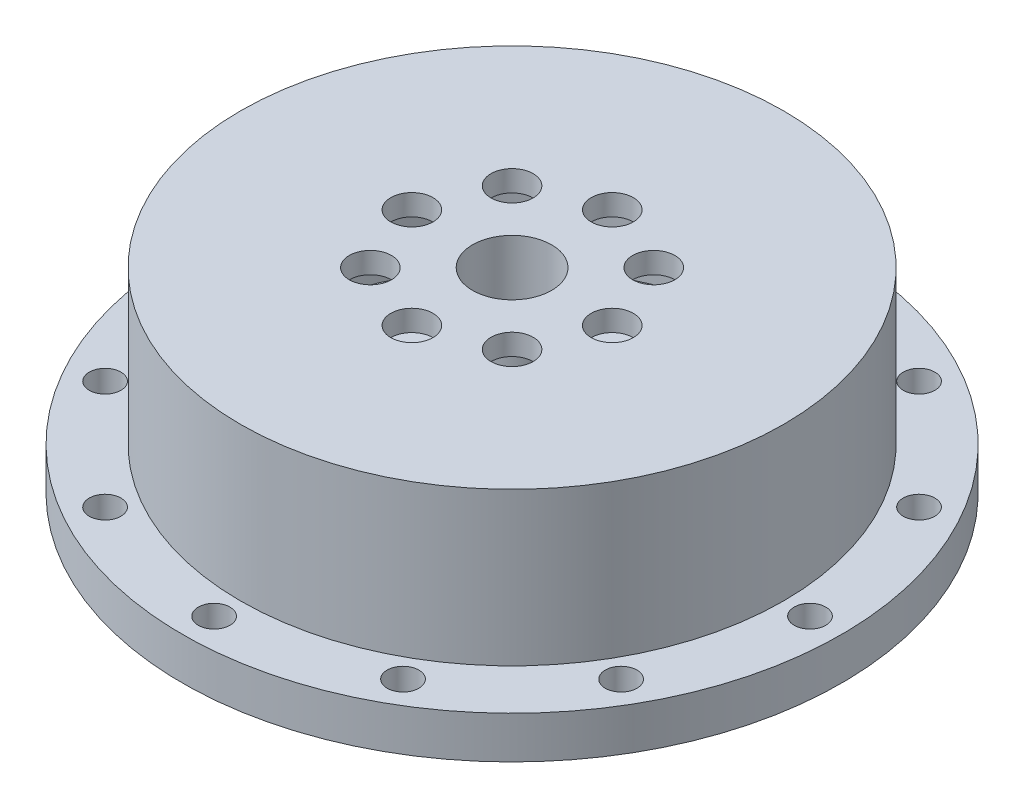
ISO-10303-21;
HEADER;
FILE_DESCRIPTION(('STEP AP214'),'2;1');
FILE_NAME('part.step','',(''),(''),'','','');
FILE_SCHEMA(('AUTOMOTIVE_DESIGN { 1 0 10303 214 1 1 1 1 }'));
ENDSEC;
DATA;
#1=APPLICATION_CONTEXT('core data for automotive mechanical design processes');
#2=APPLICATION_PROTOCOL_DEFINITION('international standard','automotive_design',2000,#1);
#3=PRODUCT_CONTEXT('',#1,'mechanical');
#4=PRODUCT('Part','Part','',(#3));
#5=PRODUCT_RELATED_PRODUCT_CATEGORY('part','',(#4));
#6=PRODUCT_DEFINITION_FORMATION('','',#4);
#7=PRODUCT_DEFINITION_CONTEXT('part definition',#1,'design');
#8=PRODUCT_DEFINITION('design','',#6,#7);
#9=PRODUCT_DEFINITION_SHAPE('','',#8);
#10=(LENGTH_UNIT() NAMED_UNIT(*) SI_UNIT(.MILLI.,.METRE.));
#11=(NAMED_UNIT(*) PLANE_ANGLE_UNIT() SI_UNIT($,.RADIAN.));
#12=(NAMED_UNIT(*) SI_UNIT($,.STERADIAN.) SOLID_ANGLE_UNIT());
#13=UNCERTAINTY_MEASURE_WITH_UNIT(LENGTH_MEASURE(1.E-05),#10,'distance_accuracy_value','');
#14=(GEOMETRIC_REPRESENTATION_CONTEXT(3) GLOBAL_UNCERTAINTY_ASSIGNED_CONTEXT((#13)) GLOBAL_UNIT_ASSIGNED_CONTEXT((#10,
#11,#12)) REPRESENTATION_CONTEXT('',''));
#15=CARTESIAN_POINT('',(0.,0.,0.));
#16=DIRECTION('',(0.,0.,1.));
#17=DIRECTION('',(1.,0.,0.));
#18=AXIS2_PLACEMENT_3D('',#15,#16,#17);
#19=CARTESIAN_POINT('',(7.5,32.2161096228833,0.));
#20=DIRECTION('',(0.,-1.,0.));
#21=DIRECTION('',(0.,0.,-1.));
#22=AXIS2_PLACEMENT_3D('',#19,#20,#21);
#23=PLANE('',#22);
#24=CARTESIAN_POINT('',(0.,32.2161096228833,0.));
#25=DIRECTION('',(0.,-1.,0.));
#26=DIRECTION('',(0.,0.,-1.));
#27=AXIS2_PLACEMENT_3D('',#24,#25,#26);
#28=CIRCLE('',#27,10.5);
#29=CARTESIAN_POINT('',(0.,32.2161096228833,-10.5));
#30=VERTEX_POINT('',#29);
#31=EDGE_CURVE('E11',#30,#30,#28,.T.);
#32=ORIENTED_EDGE('',*,*,#31,.T.);
#33=EDGE_LOOP('',(#32));
#34=FACE_BOUND('',#33,.T.);
#35=CARTESIAN_POINT('',(0.,32.2161096228833,0.));
#36=DIRECTION('',(0.,-1.,0.));
#37=DIRECTION('',(0.,0.,-1.));
#38=AXIS2_PLACEMENT_3D('',#35,#36,#37);
#39=CIRCLE('',#38,7.5);
#40=CARTESIAN_POINT('',(0.,32.2161096228833,-7.5));
#41=VERTEX_POINT('',#40);
#42=EDGE_CURVE('E233',#41,#41,#39,.T.);
#43=ORIENTED_EDGE('',*,*,#42,.F.);
#44=EDGE_LOOP('',(#43));
#45=FACE_BOUND('',#44,.T.);
#46=ADVANCED_FACE('F39',(#34,#45),#23,.T.);
#47=CARTESIAN_POINT('',(0.,0.,0.));
#48=DIRECTION('',(0.,-1.,0.));
#49=DIRECTION('',(0.,0.,-1.));
#50=AXIS2_PLACEMENT_3D('',#47,#48,#49);
#51=CYLINDRICAL_SURFACE('',#50,10.5);
#52=CARTESIAN_POINT('',(0.,39.2161096228833,0.));
#53=DIRECTION('',(0.,-1.,0.));
#54=DIRECTION('',(0.,0.,-1.));
#55=AXIS2_PLACEMENT_3D('',#52,#53,#54);
#56=CIRCLE('',#55,10.5);
#57=CARTESIAN_POINT('',(0.,39.2161096228833,-10.5));
#58=VERTEX_POINT('',#57);
#59=EDGE_CURVE('E46',#58,#58,#56,.T.);
#60=ORIENTED_EDGE('',*,*,#59,.T.);
#61=EDGE_LOOP('',(#60));
#62=FACE_BOUND('',#61,.T.);
#63=ORIENTED_EDGE('',*,*,#31,.F.);
#64=EDGE_LOOP('',(#63));
#65=FACE_BOUND('',#64,.T.);
#66=ADVANCED_FACE('F280',(#62,#65),#51,.T.);
#67=CARTESIAN_POINT('',(10.5,39.2161096228833,0.));
#68=DIRECTION('',(0.,-1.,0.));
#69=DIRECTION('',(0.,0.,-1.));
#70=AXIS2_PLACEMENT_3D('',#67,#68,#69);
#71=PLANE('',#70);
#72=CARTESIAN_POINT('',(13.4350288425444,39.2161096228833,-13.4350288425444));
#73=DIRECTION('',(0.,-1.,0.));
#74=DIRECTION('',(0.,0.,-1.));
#75=AXIS2_PLACEMENT_3D('',#72,#73,#74);
#76=CIRCLE('',#75,4.);
#77=CARTESIAN_POINT('',(13.4350288425444,39.2161096228833,-17.4350288425444));
#78=VERTEX_POINT('',#77);
#79=EDGE_CURVE('E158',#78,#78,#76,.T.);
#80=ORIENTED_EDGE('',*,*,#79,.F.);
#81=EDGE_LOOP('',(#80));
#82=FACE_BOUND('',#81,.T.);
#83=CARTESIAN_POINT('',(0.,39.2161096228833,-19.));
#84=DIRECTION('',(0.,-1.,0.));
#85=DIRECTION('',(0.,0.,-1.));
#86=AXIS2_PLACEMENT_3D('',#83,#84,#85);
#87=CIRCLE('',#86,4.);
#88=CARTESIAN_POINT('',(0.,39.2161096228833,-23.));
#89=VERTEX_POINT('',#88);
#90=EDGE_CURVE('E155',#89,#89,#87,.T.);
#91=ORIENTED_EDGE('',*,*,#90,.F.);
#92=EDGE_LOOP('',(#91));
#93=FACE_BOUND('',#92,.T.);
#94=CARTESIAN_POINT('',(-13.4350288425444,39.2161096228833,-13.4350288425444));
#95=DIRECTION('',(0.,-1.,0.));
#96=DIRECTION('',(0.,0.,-1.));
#97=AXIS2_PLACEMENT_3D('',#94,#95,#96);
#98=CIRCLE('',#97,4.);
#99=CARTESIAN_POINT('',(-13.4350288425444,39.2161096228833,-17.4350288425444));
#100=VERTEX_POINT('',#99);
#101=EDGE_CURVE('E152',#100,#100,#98,.T.);
#102=ORIENTED_EDGE('',*,*,#101,.F.);
#103=EDGE_LOOP('',(#102));
#104=FACE_BOUND('',#103,.T.);
#105=CARTESIAN_POINT('',(-19.,39.2161096228833,0.));
#106=DIRECTION('',(0.,-1.,0.));
#107=DIRECTION('',(0.,0.,-1.));
#108=AXIS2_PLACEMENT_3D('',#105,#106,#107);
#109=CIRCLE('',#108,4.);
#110=CARTESIAN_POINT('',(-19.,39.2161096228833,-4.));
#111=VERTEX_POINT('',#110);
#112=EDGE_CURVE('E149',#111,#111,#109,.T.);
#113=ORIENTED_EDGE('',*,*,#112,.F.);
#114=EDGE_LOOP('',(#113));
#115=FACE_BOUND('',#114,.T.);
#116=CARTESIAN_POINT('',(-13.4350288425444,39.2161096228833,13.4350288425444));
#117=DIRECTION('',(0.,-1.,0.));
#118=DIRECTION('',(0.,0.,-1.));
#119=AXIS2_PLACEMENT_3D('',#116,#117,#118);
#120=CIRCLE('',#119,4.);
#121=CARTESIAN_POINT('',(-13.4350288425444,39.2161096228833,9.4350288425444));
#122=VERTEX_POINT('',#121);
#123=EDGE_CURVE('E146',#122,#122,#120,.T.);
#124=ORIENTED_EDGE('',*,*,#123,.F.);
#125=EDGE_LOOP('',(#124));
#126=FACE_BOUND('',#125,.T.);
#127=CARTESIAN_POINT('',(0.,39.2161096228833,19.));
#128=DIRECTION('',(0.,-1.,0.));
#129=DIRECTION('',(0.,0.,-1.));
#130=AXIS2_PLACEMENT_3D('',#127,#128,#129);
#131=CIRCLE('',#130,4.);
#132=CARTESIAN_POINT('',(0.,39.2161096228833,15.));
#133=VERTEX_POINT('',#132);
#134=EDGE_CURVE('E143',#133,#133,#131,.T.);
#135=ORIENTED_EDGE('',*,*,#134,.F.);
#136=EDGE_LOOP('',(#135));
#137=FACE_BOUND('',#136,.T.);
#138=CARTESIAN_POINT('',(13.4350288425444,39.2161096228833,13.4350288425444));
#139=DIRECTION('',(0.,-1.,0.));
#140=DIRECTION('',(0.,0.,-1.));
#141=AXIS2_PLACEMENT_3D('',#138,#139,#140);
#142=CIRCLE('',#141,4.);
#143=CARTESIAN_POINT('',(13.4350288425444,39.2161096228833,9.43502884254441));
#144=VERTEX_POINT('',#143);
#145=EDGE_CURVE('E140',#144,#144,#142,.T.);
#146=ORIENTED_EDGE('',*,*,#145,.F.);
#147=EDGE_LOOP('',(#146));
#148=FACE_BOUND('',#147,.T.);
#149=CARTESIAN_POINT('',(19.,39.2161096228833,0.));
#150=DIRECTION('',(0.,-1.,0.));
#151=DIRECTION('',(0.,0.,-1.));
#152=AXIS2_PLACEMENT_3D('',#149,#150,#151);
#153=CIRCLE('',#152,4.);
#154=CARTESIAN_POINT('',(19.,39.2161096228833,-4.));
#155=VERTEX_POINT('',#154);
#156=EDGE_CURVE('E137',#155,#155,#153,.T.);
#157=ORIENTED_EDGE('',*,*,#156,.F.);
#158=EDGE_LOOP('',(#157));
#159=FACE_BOUND('',#158,.T.);
#160=CARTESIAN_POINT('',(0.,39.2161096228833,0.));
#161=DIRECTION('',(0.,-1.,0.));
#162=DIRECTION('',(0.,0.,-1.));
#163=AXIS2_PLACEMENT_3D('',#160,#161,#162);
#164=CIRCLE('',#163,48.);
#165=CARTESIAN_POINT('',(0.,39.2161096228833,-48.));
#166=VERTEX_POINT('',#165);
#167=EDGE_CURVE('E275',#166,#166,#164,.T.);
#168=ORIENTED_EDGE('',*,*,#167,.T.);
#169=EDGE_LOOP('',(#168));
#170=FACE_BOUND('',#169,.T.);
#171=ORIENTED_EDGE('',*,*,#59,.F.);
#172=EDGE_LOOP('',(#171));
#173=FACE_BOUND('',#172,.T.);
#174=ADVANCED_FACE('F283',(#82,#93,#104,#115,#126,#137,#148,#159,#170,#173),#71,.T.);
#175=CARTESIAN_POINT('',(0.,0.,0.));
#176=DIRECTION('',(0.,-1.,0.));
#177=DIRECTION('',(0.,0.,-1.));
#178=AXIS2_PLACEMENT_3D('',#175,#176,#177);
#179=CYLINDRICAL_SURFACE('',#178,48.);
#180=CARTESIAN_POINT('',(0.,9.21610962288333,0.));
#181=DIRECTION('',(0.,-1.,0.));
#182=DIRECTION('',(0.,0.,-1.));
#183=AXIS2_PLACEMENT_3D('',#180,#181,#182);
#184=CIRCLE('',#183,48.);
#185=CARTESIAN_POINT('',(0.,9.21610962288333,-48.));
#186=VERTEX_POINT('',#185);
#187=EDGE_CURVE('E272',#186,#186,#184,.T.);
#188=ORIENTED_EDGE('',*,*,#187,.T.);
#189=EDGE_LOOP('',(#188));
#190=FACE_BOUND('',#189,.T.);
#191=ORIENTED_EDGE('',*,*,#167,.F.);
#192=EDGE_LOOP('',(#191));
#193=FACE_BOUND('',#192,.T.);
#194=ADVANCED_FACE('F285',(#190,#193),#179,.F.);
#195=CARTESIAN_POINT('',(48.,9.21610962288333,0.));
#196=DIRECTION('',(0.,1.,0.));
#197=DIRECTION('',(0.,0.,1.));
#198=AXIS2_PLACEMENT_3D('',#195,#196,#197);
#199=PLANE('',#198);
#200=CARTESIAN_POINT('',(0.,9.21610962288333,0.));
#201=DIRECTION('',(0.,-1.,0.));
#202=DIRECTION('',(0.,0.,-1.));
#203=AXIS2_PLACEMENT_3D('',#200,#201,#202);
#204=CIRCLE('',#203,7.5);
#205=CARTESIAN_POINT('',(-1.00000000000039,9.21610962288333,7.4330343736592));
#206=VERTEX_POINT('',#205);
#207=CARTESIAN_POINT('',(0.999999999999613,9.21610962288333,7.4330343736593));
#208=VERTEX_POINT('',#207);
#209=EDGE_CURVE('E86',#206,#208,#204,.T.);
#210=ORIENTED_EDGE('',*,*,#209,.T.);
#211=DIRECTION('',(0.,0.,1.));
#212=VECTOR('',#211,1.);
#213=CARTESIAN_POINT('',(0.999999999999613,9.21610962288333,9.00000000000054));
#214=LINE('',#213,#212);
#215=CARTESIAN_POINT('',(0.999999999999613,9.21610962288333,6.00000000000054));
#216=VERTEX_POINT('',#215);
#217=EDGE_CURVE('E78',#216,#208,#214,.T.);
#218=ORIENTED_EDGE('',*,*,#217,.F.);
#219=DIRECTION('',(1.,0.,0.));
#220=VECTOR('',#219,1.);
#221=CARTESIAN_POINT('',(0.999999999999613,9.21610962288333,6.00000000000054));
#222=LINE('',#221,#220);
#223=CARTESIAN_POINT('',(-1.00000000000039,9.21610962288333,6.00000000000054));
#224=VERTEX_POINT('',#223);
#225=EDGE_CURVE('E84',#224,#216,#222,.T.);
#226=ORIENTED_EDGE('',*,*,#225,.F.);
#227=DIRECTION('',(0.,0.,-1.));
#228=VECTOR('',#227,1.);
#229=CARTESIAN_POINT('',(-1.00000000000039,9.21610962288333,9.00000000000054));
#230=LINE('',#229,#228);
#231=EDGE_CURVE('E88',#206,#224,#230,.T.);
#232=ORIENTED_EDGE('',*,*,#231,.F.);
#233=EDGE_LOOP('',(#210,#218,#226,#232));
#234=FACE_BOUND('',#233,.T.);
#235=ORIENTED_EDGE('',*,*,#187,.F.);
#236=EDGE_LOOP('',(#235));
#237=FACE_BOUND('',#236,.T.);
#238=ADVANCED_FACE('F80',(#234,#237),#199,.T.);
#239=CARTESIAN_POINT('',(0.,0.,0.));
#240=DIRECTION('',(0.,-1.,0.));
#241=DIRECTION('',(0.,0.,-1.));
#242=AXIS2_PLACEMENT_3D('',#239,#240,#241);
#243=CYLINDRICAL_SURFACE('',#242,7.5);
#244=DIRECTION('',(0.,-1.,0.));
#245=VECTOR('',#244,1.);
#246=CARTESIAN_POINT('',(0.999999999999613,0.,7.4330343736593));
#247=LINE('',#246,#245);
#248=CARTESIAN_POINT('',(0.999999999999612,3.21610962288333,7.4330343736593));
#249=VERTEX_POINT('',#248);
#250=EDGE_CURVE('E53',#208,#249,#247,.T.);
#251=ORIENTED_EDGE('',*,*,#250,.F.);
#252=ORIENTED_EDGE('',*,*,#209,.F.);
#253=DIRECTION('',(0.,-1.,0.));
#254=VECTOR('',#253,1.);
#255=CARTESIAN_POINT('',(-1.00000000000039,0.,7.4330343736592));
#256=LINE('',#255,#254);
#257=CARTESIAN_POINT('',(-1.00000000000039,3.21610962288333,7.4330343736592));
#258=VERTEX_POINT('',#257);
#259=EDGE_CURVE('E58',#258,#206,#256,.F.);
#260=ORIENTED_EDGE('',*,*,#259,.F.);
#261=CARTESIAN_POINT('',(0.,3.21610962288333,0.));
#262=DIRECTION('',(0.,-1.,0.));
#263=DIRECTION('',(0.,0.,-1.));
#264=AXIS2_PLACEMENT_3D('',#261,#262,#263);
#265=CIRCLE('',#264,7.5);
#266=EDGE_CURVE('E269',#258,#249,#265,.T.);
#267=ORIENTED_EDGE('',*,*,#266,.T.);
#268=EDGE_LOOP('',(#251,#252,#260,#267));
#269=FACE_BOUND('',#268,.T.);
#270=ADVANCED_FACE('F376',(#269),#243,.F.);
#271=CARTESIAN_POINT('',(10.,3.21610962288333,0.));
#272=DIRECTION('',(0.,-1.,0.));
#273=DIRECTION('',(0.,0.,-1.));
#274=AXIS2_PLACEMENT_3D('',#271,#272,#273);
#275=PLANE('',#274);
#276=ORIENTED_EDGE('',*,*,#266,.F.);
#277=DIRECTION('',(0.,0.,-1.));
#278=VECTOR('',#277,1.);
#279=CARTESIAN_POINT('',(-1.00000000000039,3.21610962288333,9.00000000000054));
#280=LINE('',#279,#278);
#281=CARTESIAN_POINT('',(-1.00000000000039,3.21610962288333,6.00000000000054));
#282=VERTEX_POINT('',#281);
#283=EDGE_CURVE('E107',#258,#282,#280,.T.);
#284=ORIENTED_EDGE('',*,*,#283,.T.);
#285=DIRECTION('',(1.,0.,0.));
#286=VECTOR('',#285,1.);
#287=CARTESIAN_POINT('',(0.999999999999613,3.21610962288333,6.00000000000054));
#288=LINE('',#287,#286);
#289=CARTESIAN_POINT('',(0.999999999999613,3.21610962288333,6.00000000000054));
#290=VERTEX_POINT('',#289);
#291=EDGE_CURVE('E103',#282,#290,#288,.T.);
#292=ORIENTED_EDGE('',*,*,#291,.T.);
#293=DIRECTION('',(0.,0.,1.));
#294=VECTOR('',#293,1.);
#295=CARTESIAN_POINT('',(0.999999999999613,3.21610962288333,9.00000000000054));
#296=LINE('',#295,#294);
#297=EDGE_CURVE('E94',#290,#249,#296,.T.);
#298=ORIENTED_EDGE('',*,*,#297,.T.);
#299=EDGE_LOOP('',(#276,#284,#292,#298));
#300=FACE_BOUND('',#299,.T.);
#301=CARTESIAN_POINT('',(0.,3.21610962288333,0.));
#302=DIRECTION('',(0.,-1.,0.));
#303=DIRECTION('',(0.,0.,-1.));
#304=AXIS2_PLACEMENT_3D('',#301,#302,#303);
#305=CIRCLE('',#304,10.);
#306=CARTESIAN_POINT('',(0.,3.21610962288333,-10.));
#307=VERTEX_POINT('',#306);
#308=EDGE_CURVE('E266',#307,#307,#305,.T.);
#309=ORIENTED_EDGE('',*,*,#308,.T.);
#310=EDGE_LOOP('',(#309));
#311=FACE_BOUND('',#310,.T.);
#312=ADVANCED_FACE('F371',(#300,#311),#275,.T.);
#313=CARTESIAN_POINT('',(0.,0.,0.));
#314=DIRECTION('',(0.,-1.,0.));
#315=DIRECTION('',(0.,0.,-1.));
#316=AXIS2_PLACEMENT_3D('',#313,#314,#315);
#317=CYLINDRICAL_SURFACE('',#316,10.);
#318=CARTESIAN_POINT('',(0.,6.21610962288333,0.));
#319=DIRECTION('',(0.,-1.,0.));
#320=DIRECTION('',(0.,0.,-1.));
#321=AXIS2_PLACEMENT_3D('',#318,#319,#320);
#322=CIRCLE('',#321,10.);
#323=CARTESIAN_POINT('',(0.,6.21610962288333,-10.));
#324=VERTEX_POINT('',#323);
#325=EDGE_CURVE('E263',#324,#324,#322,.T.);
#326=ORIENTED_EDGE('',*,*,#325,.T.);
#327=EDGE_LOOP('',(#326));
#328=FACE_BOUND('',#327,.T.);
#329=ORIENTED_EDGE('',*,*,#308,.F.);
#330=EDGE_LOOP('',(#329));
#331=FACE_BOUND('',#330,.T.);
#332=ADVANCED_FACE('F365',(#328,#331),#317,.T.);
#333=CARTESIAN_POINT('',(36.,6.21610962288334,0.));
#334=DIRECTION('',(0.,-1.,0.));
#335=DIRECTION('',(0.,0.,-1.));
#336=AXIS2_PLACEMENT_3D('',#333,#334,#335);
#337=PLANE('',#336);
#338=CARTESIAN_POINT('',(0.,6.21610962288334,0.));
#339=DIRECTION('',(0.,-1.,0.));
#340=DIRECTION('',(0.,0.,-1.));
#341=AXIS2_PLACEMENT_3D('',#338,#339,#340);
#342=CIRCLE('',#341,36.);
#343=CARTESIAN_POINT('',(0.,6.21610962288334,-36.));
#344=VERTEX_POINT('',#343);
#345=EDGE_CURVE('E260',#344,#344,#342,.T.);
#346=ORIENTED_EDGE('',*,*,#345,.T.);
#347=EDGE_LOOP('',(#346));
#348=FACE_BOUND('',#347,.T.);
#349=ORIENTED_EDGE('',*,*,#325,.F.);
#350=EDGE_LOOP('',(#349));
#351=FACE_BOUND('',#350,.T.);
#352=ADVANCED_FACE('F359',(#348,#351),#337,.T.);
#353=CARTESIAN_POINT('',(0.,0.,0.));
#354=DIRECTION('',(0.,-1.,0.));
#355=DIRECTION('',(0.,0.,-1.));
#356=AXIS2_PLACEMENT_3D('',#353,#354,#355);
#357=CYLINDRICAL_SURFACE('',#356,36.);
#358=CARTESIAN_POINT('',(0.,4.21610962288333,0.));
#359=DIRECTION('',(0.,-1.,0.));
#360=DIRECTION('',(0.,0.,-1.));
#361=AXIS2_PLACEMENT_3D('',#358,#359,#360);
#362=CIRCLE('',#361,36.);
#363=CARTESIAN_POINT('',(0.,4.21610962288333,-36.));
#364=VERTEX_POINT('',#363);
#365=EDGE_CURVE('E257',#364,#364,#362,.T.);
#366=ORIENTED_EDGE('',*,*,#365,.T.);
#367=EDGE_LOOP('',(#366));
#368=FACE_BOUND('',#367,.T.);
#369=ORIENTED_EDGE('',*,*,#345,.F.);
#370=EDGE_LOOP('',(#369));
#371=FACE_BOUND('',#370,.T.);
#372=ADVANCED_FACE('F353',(#368,#371),#357,.F.);
#373=CARTESIAN_POINT('',(36.,4.21610962288333,0.));
#374=DIRECTION('',(0.,-1.,0.));
#375=DIRECTION('',(0.,0.,-1.));
#376=AXIS2_PLACEMENT_3D('',#373,#374,#375);
#377=PLANE('',#376);
#378=CARTESIAN_POINT('',(0.,4.21610962288333,0.));
#379=DIRECTION('',(0.,-1.,0.));
#380=DIRECTION('',(0.,0.,-1.));
#381=AXIS2_PLACEMENT_3D('',#378,#379,#380);
#382=CIRCLE('',#381,39.);
#383=CARTESIAN_POINT('',(0.,4.21610962288333,-39.));
#384=VERTEX_POINT('',#383);
#385=EDGE_CURVE('E254',#384,#384,#382,.T.);
#386=ORIENTED_EDGE('',*,*,#385,.T.);
#387=EDGE_LOOP('',(#386));
#388=FACE_BOUND('',#387,.T.);
#389=ORIENTED_EDGE('',*,*,#365,.F.);
#390=EDGE_LOOP('',(#389));
#391=FACE_BOUND('',#390,.T.);
#392=ADVANCED_FACE('F347',(#388,#391),#377,.T.);
#393=CARTESIAN_POINT('',(0.,0.,0.));
#394=DIRECTION('',(0.,-1.,0.));
#395=DIRECTION('',(0.,0.,-1.));
#396=AXIS2_PLACEMENT_3D('',#393,#394,#395);
#397=CYLINDRICAL_SURFACE('',#396,39.);
#398=CARTESIAN_POINT('',(0.,6.21610962288334,0.));
#399=DIRECTION('',(0.,-1.,0.));
#400=DIRECTION('',(0.,0.,-1.));
#401=AXIS2_PLACEMENT_3D('',#398,#399,#400);
#402=CIRCLE('',#401,39.);
#403=CARTESIAN_POINT('',(0.,6.21610962288334,-39.));
#404=VERTEX_POINT('',#403);
#405=EDGE_CURVE('E251',#404,#404,#402,.T.);
#406=ORIENTED_EDGE('',*,*,#405,.T.);
#407=EDGE_LOOP('',(#406));
#408=FACE_BOUND('',#407,.T.);
#409=ORIENTED_EDGE('',*,*,#385,.F.);
#410=EDGE_LOOP('',(#409));
#411=FACE_BOUND('',#410,.T.);
#412=ADVANCED_FACE('F340',(#408,#411),#397,.T.);
#413=CARTESIAN_POINT('',(62.5,6.21610962288334,0.));
#414=DIRECTION('',(0.,-1.,0.));
#415=DIRECTION('',(0.,0.,-1.));
#416=AXIS2_PLACEMENT_3D('',#413,#414,#415);
#417=PLANE('',#416);
#418=CARTESIAN_POINT('',(56.5,6.21610962288334,0.));
#419=DIRECTION('',(0.,-1.,0.));
#420=DIRECTION('',(0.,0.,-1.));
#421=AXIS2_PLACEMENT_3D('',#418,#419,#420);
#422=CIRCLE('',#421,3.);
#423=CARTESIAN_POINT('',(56.5,6.21610962288334,-3.));
#424=VERTEX_POINT('',#423);
#425=EDGE_CURVE('E230',#424,#424,#422,.T.);
#426=ORIENTED_EDGE('',*,*,#425,.F.);
#427=EDGE_LOOP('',(#426));
#428=FACE_BOUND('',#427,.T.);
#429=CARTESIAN_POINT('',(48.9304353138211,6.21610962288334,-28.2499999999994));
#430=DIRECTION('',(0.,-1.,0.));
#431=DIRECTION('',(0.,0.,-1.));
#432=AXIS2_PLACEMENT_3D('',#429,#430,#431);
#433=CIRCLE('',#432,3.00000000000001);
#434=CARTESIAN_POINT('',(48.9304353138211,6.21610962288334,-31.2499999999994));
#435=VERTEX_POINT('',#434);
#436=EDGE_CURVE('E227',#435,#435,#433,.T.);
#437=ORIENTED_EDGE('',*,*,#436,.F.);
#438=EDGE_LOOP('',(#437));
#439=FACE_BOUND('',#438,.T.);
#440=CARTESIAN_POINT('',(28.2500000000006,6.21610962288334,-48.9304353138205));
#441=DIRECTION('',(0.,-1.,0.));
#442=DIRECTION('',(0.,0.,-1.));
#443=AXIS2_PLACEMENT_3D('',#440,#441,#442);
#444=CIRCLE('',#443,3.00000000000001);
#445=CARTESIAN_POINT('',(28.2500000000006,6.21610962288334,-51.9304353138205));
#446=VERTEX_POINT('',#445);
#447=EDGE_CURVE('E224',#446,#446,#444,.T.);
#448=ORIENTED_EDGE('',*,*,#447,.F.);
#449=EDGE_LOOP('',(#448));
#450=FACE_BOUND('',#449,.T.);
#451=CARTESIAN_POINT('',(5.91806086933911E-13,6.21610962288334,-56.5));
#452=DIRECTION('',(0.,-1.,0.));
#453=DIRECTION('',(0.,0.,-1.));
#454=AXIS2_PLACEMENT_3D('',#451,#452,#453);
#455=CIRCLE('',#454,3.);
#456=CARTESIAN_POINT('',(5.91806086933911E-13,6.21610962288334,-59.5));
#457=VERTEX_POINT('',#456);
#458=EDGE_CURVE('E221',#457,#457,#455,.T.);
#459=ORIENTED_EDGE('',*,*,#458,.F.);
#460=EDGE_LOOP('',(#459));
#461=FACE_BOUND('',#460,.T.);
#462=CARTESIAN_POINT('',(48.9304353138207,6.21610962288334,28.2500000000001));
#463=DIRECTION('',(0.,-1.,0.));
#464=DIRECTION('',(0.,0.,-1.));
#465=AXIS2_PLACEMENT_3D('',#462,#463,#464);
#466=CIRCLE('',#465,3.);
#467=CARTESIAN_POINT('',(48.9304353138207,6.21610962288334,25.2500000000001));
#468=VERTEX_POINT('',#467);
#469=EDGE_CURVE('E218',#468,#468,#466,.T.);
#470=ORIENTED_EDGE('',*,*,#469,.F.);
#471=EDGE_LOOP('',(#470));
#472=FACE_BOUND('',#471,.T.);
#473=CARTESIAN_POINT('',(28.2499999999999,6.21610962288334,48.9304353138209));
#474=DIRECTION('',(0.,-1.,0.));
#475=DIRECTION('',(0.,0.,-1.));
#476=AXIS2_PLACEMENT_3D('',#473,#474,#475);
#477=CIRCLE('',#476,3.);
#478=CARTESIAN_POINT('',(28.2499999999999,6.21610962288334,45.9304353138209));
#479=VERTEX_POINT('',#478);
#480=EDGE_CURVE('E215',#479,#479,#477,.T.);
#481=ORIENTED_EDGE('',*,*,#480,.F.);
#482=EDGE_LOOP('',(#481));
#483=FACE_BOUND('',#482,.T.);
#484=CARTESIAN_POINT('',(-1.97268695644637E-13,6.21610962288334,56.5));
#485=DIRECTION('',(0.,-1.,0.));
#486=DIRECTION('',(0.,0.,-1.));
#487=AXIS2_PLACEMENT_3D('',#484,#485,#486);
#488=CIRCLE('',#487,3.);
#489=CARTESIAN_POINT('',(-1.97268695644637E-13,6.21610962288334,53.5));
#490=VERTEX_POINT('',#489);
#491=EDGE_CURVE('E212',#490,#490,#488,.T.);
#492=ORIENTED_EDGE('',*,*,#491,.F.);
#493=EDGE_LOOP('',(#492));
#494=FACE_BOUND('',#493,.T.);
#495=CARTESIAN_POINT('',(-28.2500000000002,6.21610962288334,48.9304353138206));
#496=DIRECTION('',(0.,-1.,0.));
#497=DIRECTION('',(0.,0.,-1.));
#498=AXIS2_PLACEMENT_3D('',#495,#496,#497);
#499=CIRCLE('',#498,2.99999999999999);
#500=CARTESIAN_POINT('',(-28.2500000000002,6.21610962288334,45.9304353138206));
#501=VERTEX_POINT('',#500);
#502=EDGE_CURVE('E209',#501,#501,#499,.T.);
#503=ORIENTED_EDGE('',*,*,#502,.F.);
#504=EDGE_LOOP('',(#503));
#505=FACE_BOUND('',#504,.T.);
#506=CARTESIAN_POINT('',(-48.9304353138209,6.21610962288334,28.2499999999997));
#507=DIRECTION('',(0.,-1.,0.));
#508=DIRECTION('',(0.,0.,-1.));
#509=AXIS2_PLACEMENT_3D('',#506,#507,#508);
#510=CIRCLE('',#509,3.);
#511=CARTESIAN_POINT('',(-48.9304353138209,6.21610962288334,25.2499999999997));
#512=VERTEX_POINT('',#511);
#513=EDGE_CURVE('E206',#512,#512,#510,.T.);
#514=ORIENTED_EDGE('',*,*,#513,.F.);
#515=EDGE_LOOP('',(#514));
#516=FACE_BOUND('',#515,.T.);
#517=CARTESIAN_POINT('',(-56.5,6.21610962288334,-3.94537391289274E-13));
#518=DIRECTION('',(0.,-1.,0.));
#519=DIRECTION('',(0.,0.,-1.));
#520=AXIS2_PLACEMENT_3D('',#517,#518,#519);
#521=CIRCLE('',#520,3.);
#522=CARTESIAN_POINT('',(-56.5,6.21610962288334,-3.0000000000004));
#523=VERTEX_POINT('',#522);
#524=EDGE_CURVE('E203',#523,#523,#521,.T.);
#525=ORIENTED_EDGE('',*,*,#524,.F.);
#526=EDGE_LOOP('',(#525));
#527=FACE_BOUND('',#526,.T.);
#528=CARTESIAN_POINT('',(-48.9304353138205,6.21610962288334,-28.2500000000004));
#529=DIRECTION('',(0.,-1.,0.));
#530=DIRECTION('',(0.,0.,-1.));
#531=AXIS2_PLACEMENT_3D('',#528,#529,#530);
#532=CIRCLE('',#531,3.);
#533=CARTESIAN_POINT('',(-48.9304353138205,6.21610962288334,-31.2500000000004));
#534=VERTEX_POINT('',#533);
#535=EDGE_CURVE('E200',#534,#534,#532,.T.);
#536=ORIENTED_EDGE('',*,*,#535,.F.);
#537=EDGE_LOOP('',(#536));
#538=FACE_BOUND('',#537,.T.);
#539=CARTESIAN_POINT('',(-28.2499999999995,6.21610962288334,-48.930435313821));
#540=DIRECTION('',(0.,-1.,0.));
#541=DIRECTION('',(0.,0.,-1.));
#542=AXIS2_PLACEMENT_3D('',#539,#540,#541);
#543=CIRCLE('',#542,3.);
#544=CARTESIAN_POINT('',(-28.2499999999995,6.21610962288334,-51.930435313821));
#545=VERTEX_POINT('',#544);
#546=EDGE_CURVE('E165',#545,#545,#543,.T.);
#547=ORIENTED_EDGE('',*,*,#546,.F.);
#548=EDGE_LOOP('',(#547));
#549=FACE_BOUND('',#548,.T.);
#550=CARTESIAN_POINT('',(0.,6.21610962288334,0.));
#551=DIRECTION('',(0.,-1.,0.));
#552=DIRECTION('',(0.,0.,-1.));
#553=AXIS2_PLACEMENT_3D('',#550,#551,#552);
#554=CIRCLE('',#553,62.5);
#555=CARTESIAN_POINT('',(0.,6.21610962288334,-62.5));
#556=VERTEX_POINT('',#555);
#557=EDGE_CURVE('E248',#556,#556,#554,.T.);
#558=ORIENTED_EDGE('',*,*,#557,.T.);
#559=EDGE_LOOP('',(#558));
#560=FACE_BOUND('',#559,.T.);
#561=ORIENTED_EDGE('',*,*,#405,.F.);
#562=EDGE_LOOP('',(#561));
#563=FACE_BOUND('',#562,.T.);
#564=ADVANCED_FACE('F334',(#428,#439,#450,#461,#472,#483,#494,#505,#516,#527,#538,#549,#560,
#563),#417,.T.);
#565=CARTESIAN_POINT('',(0.,0.,0.));
#566=DIRECTION('',(0.,-1.,0.));
#567=DIRECTION('',(0.,0.,-1.));
#568=AXIS2_PLACEMENT_3D('',#565,#566,#567);
#569=CYLINDRICAL_SURFACE('',#568,62.5);
#570=CARTESIAN_POINT('',(0.,14.2161096228833,0.));
#571=DIRECTION('',(0.,-1.,0.));
#572=DIRECTION('',(0.,0.,-1.));
#573=AXIS2_PLACEMENT_3D('',#570,#571,#572);
#574=CIRCLE('',#573,62.5);
#575=CARTESIAN_POINT('',(0.,14.2161096228833,-62.5));
#576=VERTEX_POINT('',#575);
#577=EDGE_CURVE('E245',#576,#576,#574,.T.);
#578=ORIENTED_EDGE('',*,*,#577,.T.);
#579=EDGE_LOOP('',(#578));
#580=FACE_BOUND('',#579,.T.);
#581=ORIENTED_EDGE('',*,*,#557,.F.);
#582=EDGE_LOOP('',(#581));
#583=FACE_BOUND('',#582,.T.);
#584=ADVANCED_FACE('F327',(#580,#583),#569,.T.);
#585=CARTESIAN_POINT('',(51.5,14.2161096228833,0.));
#586=DIRECTION('',(0.,1.,0.));
#587=DIRECTION('',(0.,0.,1.));
#588=AXIS2_PLACEMENT_3D('',#585,#586,#587);
#589=PLANE('',#588);
#590=CARTESIAN_POINT('',(56.5,14.2161096228833,0.));
#591=DIRECTION('',(0.,1.,0.));
#592=DIRECTION('',(0.,0.,1.));
#593=AXIS2_PLACEMENT_3D('',#590,#591,#592);
#594=CIRCLE('',#593,3.);
#595=CARTESIAN_POINT('',(56.5,14.2161096228833,3.));
#596=VERTEX_POINT('',#595);
#597=EDGE_CURVE('E162',#596,#596,#594,.T.);
#598=ORIENTED_EDGE('',*,*,#597,.F.);
#599=EDGE_LOOP('',(#598));
#600=FACE_BOUND('',#599,.T.);
#601=CARTESIAN_POINT('',(48.9304353138211,14.2161096228833,-28.2499999999994));
#602=DIRECTION('',(0.,1.,0.));
#603=DIRECTION('',(0.,0.,1.));
#604=AXIS2_PLACEMENT_3D('',#601,#602,#603);
#605=CIRCLE('',#604,3.00000000000001);
#606=CARTESIAN_POINT('',(48.9304353138211,14.2161096228833,-25.2499999999994));
#607=VERTEX_POINT('',#606);
#608=EDGE_CURVE('E161',#607,#607,#605,.T.);
#609=ORIENTED_EDGE('',*,*,#608,.F.);
#610=EDGE_LOOP('',(#609));
#611=FACE_BOUND('',#610,.T.);
#612=CARTESIAN_POINT('',(28.2500000000006,14.2161096228833,-48.9304353138205));
#613=DIRECTION('',(0.,1.,0.));
#614=DIRECTION('',(0.,0.,1.));
#615=AXIS2_PLACEMENT_3D('',#612,#613,#614);
#616=CIRCLE('',#615,3.00000000000001);
#617=CARTESIAN_POINT('',(28.2500000000006,14.2161096228833,-45.9304353138204));
#618=VERTEX_POINT('',#617);
#619=EDGE_CURVE('E171',#618,#618,#616,.T.);
#620=ORIENTED_EDGE('',*,*,#619,.F.);
#621=EDGE_LOOP('',(#620));
#622=FACE_BOUND('',#621,.T.);
#623=CARTESIAN_POINT('',(5.91806086933911E-13,14.2161096228833,-56.5));
#624=DIRECTION('',(0.,1.,0.));
#625=DIRECTION('',(0.,0.,1.));
#626=AXIS2_PLACEMENT_3D('',#623,#624,#625);
#627=CIRCLE('',#626,3.);
#628=CARTESIAN_POINT('',(5.91806086933911E-13,14.2161096228833,-53.5));
#629=VERTEX_POINT('',#628);
#630=EDGE_CURVE('E167',#629,#629,#627,.T.);
#631=ORIENTED_EDGE('',*,*,#630,.F.);
#632=EDGE_LOOP('',(#631));
#633=FACE_BOUND('',#632,.T.);
#634=CARTESIAN_POINT('',(48.9304353138207,14.2161096228833,28.2500000000001));
#635=DIRECTION('',(0.,1.,0.));
#636=DIRECTION('',(0.,0.,1.));
#637=AXIS2_PLACEMENT_3D('',#634,#635,#636);
#638=CIRCLE('',#637,3.);
#639=CARTESIAN_POINT('',(48.9304353138207,14.2161096228833,31.2500000000001));
#640=VERTEX_POINT('',#639);
#641=EDGE_CURVE('E166',#640,#640,#638,.T.);
#642=ORIENTED_EDGE('',*,*,#641,.F.);
#643=EDGE_LOOP('',(#642));
#644=FACE_BOUND('',#643,.T.);
#645=CARTESIAN_POINT('',(28.2499999999999,14.2161096228833,48.9304353138209));
#646=DIRECTION('',(0.,1.,0.));
#647=DIRECTION('',(0.,0.,1.));
#648=AXIS2_PLACEMENT_3D('',#645,#646,#647);
#649=CIRCLE('',#648,3.);
#650=CARTESIAN_POINT('',(28.2499999999999,14.2161096228833,51.9304353138209));
#651=VERTEX_POINT('',#650);
#652=EDGE_CURVE('E190',#651,#651,#649,.T.);
#653=ORIENTED_EDGE('',*,*,#652,.F.);
#654=EDGE_LOOP('',(#653));
#655=FACE_BOUND('',#654,.T.);
#656=CARTESIAN_POINT('',(-1.97268695644637E-13,14.2161096228833,56.5));
#657=DIRECTION('',(0.,1.,0.));
#658=DIRECTION('',(0.,0.,1.));
#659=AXIS2_PLACEMENT_3D('',#656,#657,#658);
#660=CIRCLE('',#659,3.);
#661=CARTESIAN_POINT('',(-1.97268695644637E-13,14.2161096228833,59.5));
#662=VERTEX_POINT('',#661);
#663=EDGE_CURVE('E193',#662,#662,#660,.T.);
#664=ORIENTED_EDGE('',*,*,#663,.F.);
#665=EDGE_LOOP('',(#664));
#666=FACE_BOUND('',#665,.T.);
#667=CARTESIAN_POINT('',(-28.2500000000002,14.2161096228833,48.9304353138206));
#668=DIRECTION('',(0.,1.,0.));
#669=DIRECTION('',(0.,0.,1.));
#670=AXIS2_PLACEMENT_3D('',#667,#668,#669);
#671=CIRCLE('',#670,2.99999999999999);
#672=CARTESIAN_POINT('',(-28.2500000000002,14.2161096228833,51.9304353138206));
#673=VERTEX_POINT('',#672);
#674=EDGE_CURVE('E179',#673,#673,#671,.T.);
#675=ORIENTED_EDGE('',*,*,#674,.F.);
#676=EDGE_LOOP('',(#675));
#677=FACE_BOUND('',#676,.T.);
#678=CARTESIAN_POINT('',(-48.9304353138209,14.2161096228833,28.2499999999997));
#679=DIRECTION('',(0.,1.,0.));
#680=DIRECTION('',(0.,0.,1.));
#681=AXIS2_PLACEMENT_3D('',#678,#679,#680);
#682=CIRCLE('',#681,3.);
#683=CARTESIAN_POINT('',(-48.9304353138209,14.2161096228833,31.2499999999997));
#684=VERTEX_POINT('',#683);
#685=EDGE_CURVE('E176',#684,#684,#682,.T.);
#686=ORIENTED_EDGE('',*,*,#685,.F.);
#687=EDGE_LOOP('',(#686));
#688=FACE_BOUND('',#687,.T.);
#689=CARTESIAN_POINT('',(-56.5,14.2161096228833,-3.94537391289274E-13));
#690=DIRECTION('',(0.,1.,0.));
#691=DIRECTION('',(0.,0.,1.));
#692=AXIS2_PLACEMENT_3D('',#689,#690,#691);
#693=CIRCLE('',#692,3.);
#694=CARTESIAN_POINT('',(-56.5,14.2161096228833,2.99999999999961));
#695=VERTEX_POINT('',#694);
#696=EDGE_CURVE('E180',#695,#695,#693,.T.);
#697=ORIENTED_EDGE('',*,*,#696,.F.);
#698=EDGE_LOOP('',(#697));
#699=FACE_BOUND('',#698,.T.);
#700=CARTESIAN_POINT('',(-48.9304353138205,14.2161096228833,-28.2500000000004));
#701=DIRECTION('',(0.,1.,0.));
#702=DIRECTION('',(0.,0.,1.));
#703=AXIS2_PLACEMENT_3D('',#700,#701,#702);
#704=CIRCLE('',#703,3.);
#705=CARTESIAN_POINT('',(-48.9304353138205,14.2161096228833,-25.2500000000004));
#706=VERTEX_POINT('',#705);
#707=EDGE_CURVE('E183',#706,#706,#704,.T.);
#708=ORIENTED_EDGE('',*,*,#707,.F.);
#709=EDGE_LOOP('',(#708));
#710=FACE_BOUND('',#709,.T.);
#711=CARTESIAN_POINT('',(-28.2499999999995,14.2161096228833,-48.930435313821));
#712=DIRECTION('',(0.,1.,0.));
#713=DIRECTION('',(0.,0.,1.));
#714=AXIS2_PLACEMENT_3D('',#711,#712,#713);
#715=CIRCLE('',#714,3.);
#716=CARTESIAN_POINT('',(-28.2499999999995,14.2161096228833,-45.930435313821));
#717=VERTEX_POINT('',#716);
#718=EDGE_CURVE('E170',#717,#717,#715,.T.);
#719=ORIENTED_EDGE('',*,*,#718,.F.);
#720=EDGE_LOOP('',(#719));
#721=FACE_BOUND('',#720,.T.);
#722=CARTESIAN_POINT('',(0.,14.2161096228833,0.));
#723=DIRECTION('',(0.,-1.,0.));
#724=DIRECTION('',(0.,0.,-1.));
#725=AXIS2_PLACEMENT_3D('',#722,#723,#724);
#726=CIRCLE('',#725,51.5);
#727=CARTESIAN_POINT('',(0.,14.2161096228833,-51.5));
#728=VERTEX_POINT('',#727);
#729=EDGE_CURVE('E242',#728,#728,#726,.T.);
#730=ORIENTED_EDGE('',*,*,#729,.T.);
#731=EDGE_LOOP('',(#730));
#732=FACE_BOUND('',#731,.T.);
#733=ORIENTED_EDGE('',*,*,#577,.F.);
#734=EDGE_LOOP('',(#733));
#735=FACE_BOUND('',#734,.T.);
#736=ADVANCED_FACE('F321',(#600,#611,#622,#633,#644,#655,#666,#677,#688,#699,#710,#721,#732,
#735),#589,.T.);
#737=CARTESIAN_POINT('',(0.,0.,0.));
#738=DIRECTION('',(0.,-1.,0.));
#739=DIRECTION('',(0.,0.,-1.));
#740=AXIS2_PLACEMENT_3D('',#737,#738,#739);
#741=CYLINDRICAL_SURFACE('',#740,51.5);
#742=CARTESIAN_POINT('',(0.,43.2161096228833,0.));
#743=DIRECTION('',(0.,-1.,0.));
#744=DIRECTION('',(0.,0.,-1.));
#745=AXIS2_PLACEMENT_3D('',#742,#743,#744);
#746=CIRCLE('',#745,51.5);
#747=CARTESIAN_POINT('',(0.,43.2161096228833,-51.5));
#748=VERTEX_POINT('',#747);
#749=EDGE_CURVE('E239',#748,#748,#746,.T.);
#750=ORIENTED_EDGE('',*,*,#749,.T.);
#751=EDGE_LOOP('',(#750));
#752=FACE_BOUND('',#751,.T.);
#753=ORIENTED_EDGE('',*,*,#729,.F.);
#754=EDGE_LOOP('',(#753));
#755=FACE_BOUND('',#754,.T.);
#756=ADVANCED_FACE('F314',(#752,#755),#741,.T.);
#757=CARTESIAN_POINT('',(7.5,43.2161096228833,0.));
#758=DIRECTION('',(0.,1.,0.));
#759=DIRECTION('',(0.,0.,1.));
#760=AXIS2_PLACEMENT_3D('',#757,#758,#759);
#761=PLANE('',#760);
#762=CARTESIAN_POINT('',(13.4350288425444,43.2161096228833,-13.4350288425444));
#763=DIRECTION('',(0.,1.,0.));
#764=DIRECTION('',(0.,0.,1.));
#765=AXIS2_PLACEMENT_3D('',#762,#763,#764);
#766=CIRCLE('',#765,4.);
#767=CARTESIAN_POINT('',(13.4350288425444,43.2161096228833,-9.43502884254441));
#768=VERTEX_POINT('',#767);
#769=EDGE_CURVE('E113',#768,#768,#766,.T.);
#770=ORIENTED_EDGE('',*,*,#769,.F.);
#771=EDGE_LOOP('',(#770));
#772=FACE_BOUND('',#771,.T.);
#773=CARTESIAN_POINT('',(0.,43.2161096228833,-19.));
#774=DIRECTION('',(0.,1.,0.));
#775=DIRECTION('',(0.,0.,1.));
#776=AXIS2_PLACEMENT_3D('',#773,#774,#775);
#777=CIRCLE('',#776,4.);
#778=CARTESIAN_POINT('',(0.,43.2161096228833,-15.));
#779=VERTEX_POINT('',#778);
#780=EDGE_CURVE('E130',#779,#779,#777,.T.);
#781=ORIENTED_EDGE('',*,*,#780,.F.);
#782=EDGE_LOOP('',(#781));
#783=FACE_BOUND('',#782,.T.);
#784=CARTESIAN_POINT('',(-13.4350288425444,43.2161096228833,-13.4350288425444));
#785=DIRECTION('',(0.,1.,0.));
#786=DIRECTION('',(0.,0.,1.));
#787=AXIS2_PLACEMENT_3D('',#784,#785,#786);
#788=CIRCLE('',#787,4.);
#789=CARTESIAN_POINT('',(-13.4350288425444,43.2161096228833,-9.4350288425444));
#790=VERTEX_POINT('',#789);
#791=EDGE_CURVE('E127',#790,#790,#788,.T.);
#792=ORIENTED_EDGE('',*,*,#791,.F.);
#793=EDGE_LOOP('',(#792));
#794=FACE_BOUND('',#793,.T.);
#795=CARTESIAN_POINT('',(-19.,43.2161096228833,0.));
#796=DIRECTION('',(0.,1.,0.));
#797=DIRECTION('',(0.,0.,1.));
#798=AXIS2_PLACEMENT_3D('',#795,#796,#797);
#799=CIRCLE('',#798,4.);
#800=CARTESIAN_POINT('',(-19.,43.2161096228833,4.));
#801=VERTEX_POINT('',#800);
#802=EDGE_CURVE('E124',#801,#801,#799,.T.);
#803=ORIENTED_EDGE('',*,*,#802,.F.);
#804=EDGE_LOOP('',(#803));
#805=FACE_BOUND('',#804,.T.);
#806=CARTESIAN_POINT('',(-13.4350288425444,43.2161096228833,13.4350288425444));
#807=DIRECTION('',(0.,1.,0.));
#808=DIRECTION('',(0.,0.,1.));
#809=AXIS2_PLACEMENT_3D('',#806,#807,#808);
#810=CIRCLE('',#809,4.);
#811=CARTESIAN_POINT('',(-13.4350288425444,43.2161096228833,17.4350288425444));
#812=VERTEX_POINT('',#811);
#813=EDGE_CURVE('E121',#812,#812,#810,.T.);
#814=ORIENTED_EDGE('',*,*,#813,.F.);
#815=EDGE_LOOP('',(#814));
#816=FACE_BOUND('',#815,.T.);
#817=CARTESIAN_POINT('',(0.,43.2161096228833,19.));
#818=DIRECTION('',(0.,1.,0.));
#819=DIRECTION('',(0.,0.,1.));
#820=AXIS2_PLACEMENT_3D('',#817,#818,#819);
#821=CIRCLE('',#820,4.);
#822=CARTESIAN_POINT('',(0.,43.2161096228833,23.));
#823=VERTEX_POINT('',#822);
#824=EDGE_CURVE('E118',#823,#823,#821,.T.);
#825=ORIENTED_EDGE('',*,*,#824,.F.);
#826=EDGE_LOOP('',(#825));
#827=FACE_BOUND('',#826,.T.);
#828=CARTESIAN_POINT('',(13.4350288425444,43.2161096228833,13.4350288425444));
#829=DIRECTION('',(0.,1.,0.));
#830=DIRECTION('',(0.,0.,1.));
#831=AXIS2_PLACEMENT_3D('',#828,#829,#830);
#832=CIRCLE('',#831,4.);
#833=CARTESIAN_POINT('',(13.4350288425444,43.2161096228833,17.4350288425444));
#834=VERTEX_POINT('',#833);
#835=EDGE_CURVE('E114',#834,#834,#832,.T.);
#836=ORIENTED_EDGE('',*,*,#835,.F.);
#837=EDGE_LOOP('',(#836));
#838=FACE_BOUND('',#837,.T.);
#839=CARTESIAN_POINT('',(19.,43.2161096228833,0.));
#840=DIRECTION('',(0.,1.,0.));
#841=DIRECTION('',(0.,0.,1.));
#842=AXIS2_PLACEMENT_3D('',#839,#840,#841);
#843=CIRCLE('',#842,4.);
#844=CARTESIAN_POINT('',(19.,43.2161096228833,4.));
#845=VERTEX_POINT('',#844);
#846=EDGE_CURVE('E117',#845,#845,#843,.T.);
#847=ORIENTED_EDGE('',*,*,#846,.F.);
#848=EDGE_LOOP('',(#847));
#849=FACE_BOUND('',#848,.T.);
#850=CARTESIAN_POINT('',(0.,43.2161096228833,0.));
#851=DIRECTION('',(0.,-1.,0.));
#852=DIRECTION('',(0.,0.,-1.));
#853=AXIS2_PLACEMENT_3D('',#850,#851,#852);
#854=CIRCLE('',#853,7.5);
#855=CARTESIAN_POINT('',(0.,43.2161096228833,-7.5));
#856=VERTEX_POINT('',#855);
#857=EDGE_CURVE('E236',#856,#856,#854,.T.);
#858=ORIENTED_EDGE('',*,*,#857,.T.);
#859=EDGE_LOOP('',(#858));
#860=FACE_BOUND('',#859,.T.);
#861=ORIENTED_EDGE('',*,*,#749,.F.);
#862=EDGE_LOOP('',(#861));
#863=FACE_BOUND('',#862,.T.);
#864=ADVANCED_FACE('F308',(#772,#783,#794,#805,#816,#827,#838,#849,#860,#863),#761,.T.);
#865=CARTESIAN_POINT('',(0.,0.,0.));
#866=DIRECTION('',(0.,-1.,0.));
#867=DIRECTION('',(0.,0.,-1.));
#868=AXIS2_PLACEMENT_3D('',#865,#866,#867);
#869=CYLINDRICAL_SURFACE('',#868,7.5);
#870=ORIENTED_EDGE('',*,*,#42,.T.);
#871=EDGE_LOOP('',(#870));
#872=FACE_BOUND('',#871,.T.);
#873=ORIENTED_EDGE('',*,*,#857,.F.);
#874=EDGE_LOOP('',(#873));
#875=FACE_BOUND('',#874,.T.);
#876=ADVANCED_FACE('F304',(#872,#875),#869,.F.);
#877=CARTESIAN_POINT('',(-28.2499999999995,4.21610962288334,-48.930435313821));
#878=DIRECTION('',(0.,1.,0.));
#879=DIRECTION('',(0.,0.,1.));
#880=AXIS2_PLACEMENT_3D('',#877,#878,#879);
#881=CYLINDRICAL_SURFACE('',#880,3.);
#882=ORIENTED_EDGE('',*,*,#546,.T.);
#883=EDGE_LOOP('',(#882));
#884=FACE_BOUND('',#883,.T.);
#885=ORIENTED_EDGE('',*,*,#718,.T.);
#886=EDGE_LOOP('',(#885));
#887=FACE_BOUND('',#886,.T.);
#888=ADVANCED_FACE('F307',(#884,#887),#881,.F.);
#889=CARTESIAN_POINT('',(-48.9304353138205,4.21610962288334,-28.2500000000004));
#890=DIRECTION('',(0.,1.,0.));
#891=DIRECTION('',(0.,0.,1.));
#892=AXIS2_PLACEMENT_3D('',#889,#890,#891);
#893=CYLINDRICAL_SURFACE('',#892,3.);
#894=ORIENTED_EDGE('',*,*,#535,.T.);
#895=EDGE_LOOP('',(#894));
#896=FACE_BOUND('',#895,.T.);
#897=ORIENTED_EDGE('',*,*,#707,.T.);
#898=EDGE_LOOP('',(#897));
#899=FACE_BOUND('',#898,.T.);
#900=ADVANCED_FACE('F489',(#896,#899),#893,.F.);
#901=CARTESIAN_POINT('',(-56.5,4.21610962288334,-3.94537391289274E-13));
#902=DIRECTION('',(0.,1.,0.));
#903=DIRECTION('',(0.,0.,1.));
#904=AXIS2_PLACEMENT_3D('',#901,#902,#903);
#905=CYLINDRICAL_SURFACE('',#904,3.);
#906=ORIENTED_EDGE('',*,*,#524,.T.);
#907=EDGE_LOOP('',(#906));
#908=FACE_BOUND('',#907,.T.);
#909=ORIENTED_EDGE('',*,*,#696,.T.);
#910=EDGE_LOOP('',(#909));
#911=FACE_BOUND('',#910,.T.);
#912=ADVANCED_FACE('F485',(#908,#911),#905,.F.);
#913=CARTESIAN_POINT('',(-48.9304353138209,4.21610962288334,28.2499999999997));
#914=DIRECTION('',(0.,1.,0.));
#915=DIRECTION('',(0.,0.,1.));
#916=AXIS2_PLACEMENT_3D('',#913,#914,#915);
#917=CYLINDRICAL_SURFACE('',#916,3.);
#918=ORIENTED_EDGE('',*,*,#513,.T.);
#919=EDGE_LOOP('',(#918));
#920=FACE_BOUND('',#919,.T.);
#921=ORIENTED_EDGE('',*,*,#685,.T.);
#922=EDGE_LOOP('',(#921));
#923=FACE_BOUND('',#922,.T.);
#924=ADVANCED_FACE('F481',(#920,#923),#917,.F.);
#925=CARTESIAN_POINT('',(-28.2500000000002,4.21610962288334,48.9304353138206));
#926=DIRECTION('',(0.,1.,0.));
#927=DIRECTION('',(0.,0.,1.));
#928=AXIS2_PLACEMENT_3D('',#925,#926,#927);
#929=CYLINDRICAL_SURFACE('',#928,2.99999999999999);
#930=ORIENTED_EDGE('',*,*,#502,.T.);
#931=EDGE_LOOP('',(#930));
#932=FACE_BOUND('',#931,.T.);
#933=ORIENTED_EDGE('',*,*,#674,.T.);
#934=EDGE_LOOP('',(#933));
#935=FACE_BOUND('',#934,.T.);
#936=ADVANCED_FACE('F484',(#932,#935),#929,.F.);
#937=CARTESIAN_POINT('',(-1.97268695644637E-13,4.21610962288334,56.5));
#938=DIRECTION('',(0.,1.,0.));
#939=DIRECTION('',(0.,0.,1.));
#940=AXIS2_PLACEMENT_3D('',#937,#938,#939);
#941=CYLINDRICAL_SURFACE('',#940,3.);
#942=ORIENTED_EDGE('',*,*,#491,.T.);
#943=EDGE_LOOP('',(#942));
#944=FACE_BOUND('',#943,.T.);
#945=ORIENTED_EDGE('',*,*,#663,.T.);
#946=EDGE_LOOP('',(#945));
#947=FACE_BOUND('',#946,.T.);
#948=ADVANCED_FACE('F503',(#944,#947),#941,.F.);
#949=CARTESIAN_POINT('',(28.2499999999999,4.21610962288334,48.9304353138209));
#950=DIRECTION('',(0.,1.,0.));
#951=DIRECTION('',(0.,0.,1.));
#952=AXIS2_PLACEMENT_3D('',#949,#950,#951);
#953=CYLINDRICAL_SURFACE('',#952,3.);
#954=ORIENTED_EDGE('',*,*,#480,.T.);
#955=EDGE_LOOP('',(#954));
#956=FACE_BOUND('',#955,.T.);
#957=ORIENTED_EDGE('',*,*,#652,.T.);
#958=EDGE_LOOP('',(#957));
#959=FACE_BOUND('',#958,.T.);
#960=ADVANCED_FACE('F499',(#956,#959),#953,.F.);
#961=CARTESIAN_POINT('',(48.9304353138207,4.21610962288334,28.2500000000001));
#962=DIRECTION('',(0.,1.,0.));
#963=DIRECTION('',(0.,0.,1.));
#964=AXIS2_PLACEMENT_3D('',#961,#962,#963);
#965=CYLINDRICAL_SURFACE('',#964,3.);
#966=ORIENTED_EDGE('',*,*,#469,.T.);
#967=EDGE_LOOP('',(#966));
#968=FACE_BOUND('',#967,.T.);
#969=ORIENTED_EDGE('',*,*,#641,.T.);
#970=EDGE_LOOP('',(#969));
#971=FACE_BOUND('',#970,.T.);
#972=ADVANCED_FACE('F473',(#968,#971),#965,.F.);
#973=CARTESIAN_POINT('',(5.91806086933911E-13,4.21610962288334,-56.5));
#974=DIRECTION('',(0.,1.,0.));
#975=DIRECTION('',(0.,0.,1.));
#976=AXIS2_PLACEMENT_3D('',#973,#974,#975);
#977=CYLINDRICAL_SURFACE('',#976,3.);
#978=ORIENTED_EDGE('',*,*,#458,.T.);
#979=EDGE_LOOP('',(#978));
#980=FACE_BOUND('',#979,.T.);
#981=ORIENTED_EDGE('',*,*,#630,.T.);
#982=EDGE_LOOP('',(#981));
#983=FACE_BOUND('',#982,.T.);
#984=ADVANCED_FACE('F469',(#980,#983),#977,.F.);
#985=CARTESIAN_POINT('',(28.2500000000006,4.21610962288334,-48.9304353138205));
#986=DIRECTION('',(0.,1.,0.));
#987=DIRECTION('',(0.,0.,1.));
#988=AXIS2_PLACEMENT_3D('',#985,#986,#987);
#989=CYLINDRICAL_SURFACE('',#988,3.00000000000001);
#990=ORIENTED_EDGE('',*,*,#447,.T.);
#991=EDGE_LOOP('',(#990));
#992=FACE_BOUND('',#991,.T.);
#993=ORIENTED_EDGE('',*,*,#619,.T.);
#994=EDGE_LOOP('',(#993));
#995=FACE_BOUND('',#994,.T.);
#996=ADVANCED_FACE('F472',(#992,#995),#989,.F.);
#997=CARTESIAN_POINT('',(48.9304353138211,4.21610962288334,-28.2499999999994));
#998=DIRECTION('',(0.,1.,0.));
#999=DIRECTION('',(0.,0.,1.));
#1000=AXIS2_PLACEMENT_3D('',#997,#998,#999);
#1001=CYLINDRICAL_SURFACE('',#1000,3.00000000000001);
#1002=ORIENTED_EDGE('',*,*,#436,.T.);
#1003=EDGE_LOOP('',(#1002));
#1004=FACE_BOUND('',#1003,.T.);
#1005=ORIENTED_EDGE('',*,*,#608,.T.);
#1006=EDGE_LOOP('',(#1005));
#1007=FACE_BOUND('',#1006,.T.);
#1008=ADVANCED_FACE('F467',(#1004,#1007),#1001,.F.);
#1009=CARTESIAN_POINT('',(56.5,4.21610962288334,0.));
#1010=DIRECTION('',(0.,1.,0.));
#1011=DIRECTION('',(0.,0.,1.));
#1012=AXIS2_PLACEMENT_3D('',#1009,#1010,#1011);
#1013=CYLINDRICAL_SURFACE('',#1012,3.);
#1014=ORIENTED_EDGE('',*,*,#425,.T.);
#1015=EDGE_LOOP('',(#1014));
#1016=FACE_BOUND('',#1015,.T.);
#1017=ORIENTED_EDGE('',*,*,#597,.T.);
#1018=EDGE_LOOP('',(#1017));
#1019=FACE_BOUND('',#1018,.T.);
#1020=ADVANCED_FACE('F463',(#1016,#1019),#1013,.F.);
#1021=CARTESIAN_POINT('',(19.,33.2161096228833,0.));
#1022=DIRECTION('',(0.,1.,0.));
#1023=DIRECTION('',(0.,0.,1.));
#1024=AXIS2_PLACEMENT_3D('',#1021,#1022,#1023);
#1025=CYLINDRICAL_SURFACE('',#1024,4.);
#1026=ORIENTED_EDGE('',*,*,#156,.T.);
#1027=EDGE_LOOP('',(#1026));
#1028=FACE_BOUND('',#1027,.T.);
#1029=ORIENTED_EDGE('',*,*,#846,.T.);
#1030=EDGE_LOOP('',(#1029));
#1031=FACE_BOUND('',#1030,.T.);
#1032=ADVANCED_FACE('F438',(#1028,#1031),#1025,.F.);
#1033=CARTESIAN_POINT('',(13.4350288425444,33.2161096228833,13.4350288425444));
#1034=DIRECTION('',(0.,1.,0.));
#1035=DIRECTION('',(0.,0.,1.));
#1036=AXIS2_PLACEMENT_3D('',#1033,#1034,#1035);
#1037=CYLINDRICAL_SURFACE('',#1036,4.);
#1038=ORIENTED_EDGE('',*,*,#145,.T.);
#1039=EDGE_LOOP('',(#1038));
#1040=FACE_BOUND('',#1039,.T.);
#1041=ORIENTED_EDGE('',*,*,#835,.T.);
#1042=EDGE_LOOP('',(#1041));
#1043=FACE_BOUND('',#1042,.T.);
#1044=ADVANCED_FACE('F434',(#1040,#1043),#1037,.F.);
#1045=CARTESIAN_POINT('',(0.,33.2161096228833,19.));
#1046=DIRECTION('',(0.,1.,0.));
#1047=DIRECTION('',(0.,0.,1.));
#1048=AXIS2_PLACEMENT_3D('',#1045,#1046,#1047);
#1049=CYLINDRICAL_SURFACE('',#1048,4.);
#1050=ORIENTED_EDGE('',*,*,#134,.T.);
#1051=EDGE_LOOP('',(#1050));
#1052=FACE_BOUND('',#1051,.T.);
#1053=ORIENTED_EDGE('',*,*,#824,.T.);
#1054=EDGE_LOOP('',(#1053));
#1055=FACE_BOUND('',#1054,.T.);
#1056=ADVANCED_FACE('F437',(#1052,#1055),#1049,.F.);
#1057=CARTESIAN_POINT('',(-13.4350288425444,33.2161096228833,13.4350288425444));
#1058=DIRECTION('',(0.,1.,0.));
#1059=DIRECTION('',(0.,0.,1.));
#1060=AXIS2_PLACEMENT_3D('',#1057,#1058,#1059);
#1061=CYLINDRICAL_SURFACE('',#1060,4.);
#1062=ORIENTED_EDGE('',*,*,#123,.T.);
#1063=EDGE_LOOP('',(#1062));
#1064=FACE_BOUND('',#1063,.T.);
#1065=ORIENTED_EDGE('',*,*,#813,.T.);
#1066=EDGE_LOOP('',(#1065));
#1067=FACE_BOUND('',#1066,.T.);
#1068=ADVANCED_FACE('F442',(#1064,#1067),#1061,.F.);
#1069=CARTESIAN_POINT('',(-19.,33.2161096228833,0.));
#1070=DIRECTION('',(0.,1.,0.));
#1071=DIRECTION('',(0.,0.,1.));
#1072=AXIS2_PLACEMENT_3D('',#1069,#1070,#1071);
#1073=CYLINDRICAL_SURFACE('',#1072,4.);
#1074=ORIENTED_EDGE('',*,*,#112,.T.);
#1075=EDGE_LOOP('',(#1074));
#1076=FACE_BOUND('',#1075,.T.);
#1077=ORIENTED_EDGE('',*,*,#802,.T.);
#1078=EDGE_LOOP('',(#1077));
#1079=FACE_BOUND('',#1078,.T.);
#1080=ADVANCED_FACE('F446',(#1076,#1079),#1073,.F.);
#1081=CARTESIAN_POINT('',(-13.4350288425444,33.2161096228833,-13.4350288425444));
#1082=DIRECTION('',(0.,1.,0.));
#1083=DIRECTION('',(0.,0.,1.));
#1084=AXIS2_PLACEMENT_3D('',#1081,#1082,#1083);
#1085=CYLINDRICAL_SURFACE('',#1084,4.);
#1086=ORIENTED_EDGE('',*,*,#101,.T.);
#1087=EDGE_LOOP('',(#1086));
#1088=FACE_BOUND('',#1087,.T.);
#1089=ORIENTED_EDGE('',*,*,#791,.T.);
#1090=EDGE_LOOP('',(#1089));
#1091=FACE_BOUND('',#1090,.T.);
#1092=ADVANCED_FACE('F450',(#1088,#1091),#1085,.F.);
#1093=CARTESIAN_POINT('',(0.,33.2161096228833,-19.));
#1094=DIRECTION('',(0.,1.,0.));
#1095=DIRECTION('',(0.,0.,1.));
#1096=AXIS2_PLACEMENT_3D('',#1093,#1094,#1095);
#1097=CYLINDRICAL_SURFACE('',#1096,4.);
#1098=ORIENTED_EDGE('',*,*,#90,.T.);
#1099=EDGE_LOOP('',(#1098));
#1100=FACE_BOUND('',#1099,.T.);
#1101=ORIENTED_EDGE('',*,*,#780,.T.);
#1102=EDGE_LOOP('',(#1101));
#1103=FACE_BOUND('',#1102,.T.);
#1104=ADVANCED_FACE('F454',(#1100,#1103),#1097,.F.);
#1105=CARTESIAN_POINT('',(13.4350288425444,33.2161096228833,-13.4350288425444));
#1106=DIRECTION('',(0.,1.,0.));
#1107=DIRECTION('',(0.,0.,1.));
#1108=AXIS2_PLACEMENT_3D('',#1105,#1106,#1107);
#1109=CYLINDRICAL_SURFACE('',#1108,4.);
#1110=ORIENTED_EDGE('',*,*,#79,.T.);
#1111=EDGE_LOOP('',(#1110));
#1112=FACE_BOUND('',#1111,.T.);
#1113=ORIENTED_EDGE('',*,*,#769,.T.);
#1114=EDGE_LOOP('',(#1113));
#1115=FACE_BOUND('',#1114,.T.);
#1116=ADVANCED_FACE('F409',(#1112,#1115),#1109,.F.);
#1117=CARTESIAN_POINT('',(0.999999999999613,12.8216608983473,6.00000000000054));
#1118=DIRECTION('',(0.,0.,-1.));
#1119=DIRECTION('',(-1.,0.,0.));
#1120=AXIS2_PLACEMENT_3D('',#1117,#1118,#1119);
#1121=PLANE('',#1120);
#1122=DIRECTION('',(0.,-1.,0.));
#1123=VECTOR('',#1122,1.);
#1124=CARTESIAN_POINT('',(-1.00000000000039,12.8216608983473,6.00000000000054));
#1125=LINE('',#1124,#1123);
#1126=EDGE_CURVE('E101',#224,#282,#1125,.T.);
#1127=ORIENTED_EDGE('',*,*,#1126,.F.);
#1128=ORIENTED_EDGE('',*,*,#225,.T.);
#1129=DIRECTION('',(0.,-1.,0.));
#1130=VECTOR('',#1129,1.);
#1131=CARTESIAN_POINT('',(0.999999999999613,12.8216608983473,6.00000000000054));
#1132=LINE('',#1131,#1130);
#1133=EDGE_CURVE('E89',#216,#290,#1132,.T.);
#1134=ORIENTED_EDGE('',*,*,#1133,.T.);
#1135=ORIENTED_EDGE('',*,*,#291,.F.);
#1136=EDGE_LOOP('',(#1127,#1128,#1134,#1135));
#1137=FACE_BOUND('',#1136,.T.);
#1138=ADVANCED_FACE('F99',(#1137),#1121,.T.);
#1139=CARTESIAN_POINT('',(0.999999999999613,12.8216608983473,9.00000000000054));
#1140=DIRECTION('',(1.,0.,0.));
#1141=DIRECTION('',(0.,0.,-1.));
#1142=AXIS2_PLACEMENT_3D('',#1139,#1140,#1141);
#1143=PLANE('',#1142);
#1144=ORIENTED_EDGE('',*,*,#217,.T.);
#1145=ORIENTED_EDGE('',*,*,#250,.T.);
#1146=ORIENTED_EDGE('',*,*,#297,.F.);
#1147=ORIENTED_EDGE('',*,*,#1133,.F.);
#1148=EDGE_LOOP('',(#1144,#1145,#1146,#1147));
#1149=FACE_BOUND('',#1148,.T.);
#1150=ADVANCED_FACE('F92',(#1149),#1143,.T.);
#1151=CARTESIAN_POINT('',(-1.00000000000039,12.8216608983473,9.00000000000054));
#1152=DIRECTION('',(-1.,0.,0.));
#1153=DIRECTION('',(0.,0.,1.));
#1154=AXIS2_PLACEMENT_3D('',#1151,#1152,#1153);
#1155=PLANE('',#1154);
#1156=ORIENTED_EDGE('',*,*,#283,.F.);
#1157=ORIENTED_EDGE('',*,*,#259,.T.);
#1158=ORIENTED_EDGE('',*,*,#231,.T.);
#1159=ORIENTED_EDGE('',*,*,#1126,.T.);
#1160=EDGE_LOOP('',(#1156,#1157,#1158,#1159));
#1161=FACE_BOUND('',#1160,.T.);
#1162=ADVANCED_FACE('F419',(#1161),#1155,.T.);
#1163=CLOSED_SHELL('',(#46,#66,#174,#194,#238,#270,#312,#332,#352,#372,#392,#412,#564,#584,#736,
#756,#864,#876,#888,#900,#912,#924,#936,#948,#960,#972,#984,#996,#1008,#1020,#1032,#1044,#1056,
#1068,#1080,#1092,#1104,#1116,#1138,#1150,#1162));
#1164=MANIFOLD_SOLID_BREP('B2',#1163);
#1165=ADVANCED_BREP_SHAPE_REPRESENTATION('',(#18,#1164),#14);
#1166=SHAPE_DEFINITION_REPRESENTATION(#9,#1165);
ENDSEC;
END-ISO-10303-21;
